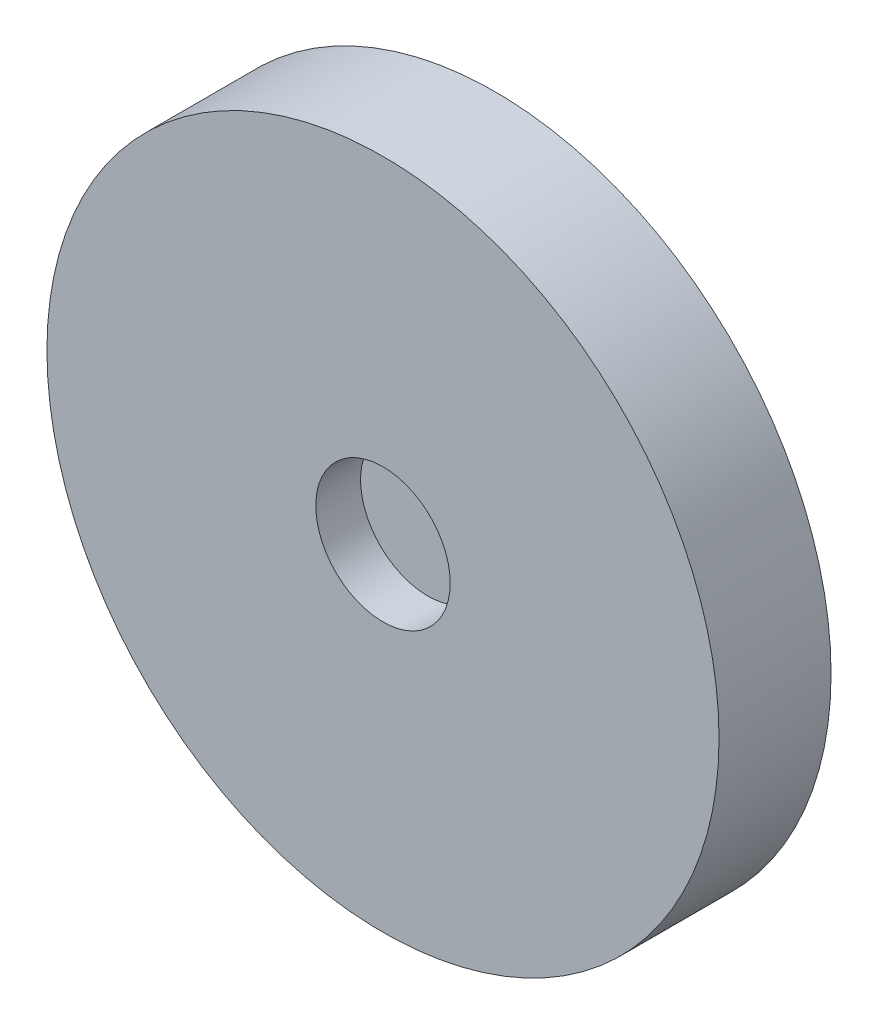
ISO-10303-21;
HEADER;
FILE_DESCRIPTION(('STEP AP214'),'2;1');
FILE_NAME('part.step','',(''),(''),'','','');
FILE_SCHEMA(('AUTOMOTIVE_DESIGN { 1 0 10303 214 1 1 1 1 }'));
ENDSEC;
DATA;
#1=APPLICATION_CONTEXT('core data for automotive mechanical design processes');
#2=APPLICATION_PROTOCOL_DEFINITION('international standard','automotive_design',2000,#1);
#3=PRODUCT_CONTEXT('',#1,'mechanical');
#4=PRODUCT('Part','Part','',(#3));
#5=PRODUCT_RELATED_PRODUCT_CATEGORY('part','',(#4));
#6=PRODUCT_DEFINITION_FORMATION('','',#4);
#7=PRODUCT_DEFINITION_CONTEXT('part definition',#1,'design');
#8=PRODUCT_DEFINITION('design','',#6,#7);
#9=PRODUCT_DEFINITION_SHAPE('','',#8);
#10=(LENGTH_UNIT() NAMED_UNIT(*) SI_UNIT(.MILLI.,.METRE.));
#11=(NAMED_UNIT(*) PLANE_ANGLE_UNIT() SI_UNIT($,.RADIAN.));
#12=(NAMED_UNIT(*) SI_UNIT($,.STERADIAN.) SOLID_ANGLE_UNIT());
#13=UNCERTAINTY_MEASURE_WITH_UNIT(LENGTH_MEASURE(1.E-05),#10,'distance_accuracy_value','');
#14=(GEOMETRIC_REPRESENTATION_CONTEXT(3) GLOBAL_UNCERTAINTY_ASSIGNED_CONTEXT((#13)) GLOBAL_UNIT_ASSIGNED_CONTEXT((#10,
#11,#12)) REPRESENTATION_CONTEXT('',''));
#15=CARTESIAN_POINT('',(0.,0.,0.));
#16=DIRECTION('',(0.,0.,1.));
#17=DIRECTION('',(1.,0.,0.));
#18=AXIS2_PLACEMENT_3D('',#15,#16,#17);
#19=CARTESIAN_POINT('',(0.,0.,50.));
#20=DIRECTION('',(0.,0.,-1.));
#21=DIRECTION('',(-1.,0.,0.));
#22=AXIS2_PLACEMENT_3D('',#19,#20,#21);
#23=CYLINDRICAL_SURFACE('',#22,150.);
#24=CARTESIAN_POINT('',(0.,0.,50.));
#25=DIRECTION('',(0.,0.,1.));
#26=DIRECTION('',(1.,0.,0.));
#27=AXIS2_PLACEMENT_3D('',#24,#25,#26);
#28=CIRCLE('',#27,150.);
#29=CARTESIAN_POINT('',(150.,0.,50.));
#30=VERTEX_POINT('',#29);
#31=EDGE_CURVE('E10',#30,#30,#28,.T.);
#32=ORIENTED_EDGE('',*,*,#31,.F.);
#33=EDGE_LOOP('',(#32));
#34=FACE_BOUND('',#33,.T.);
#35=CARTESIAN_POINT('',(0.,0.,0.));
#36=DIRECTION('',(0.,0.,1.));
#37=DIRECTION('',(1.,0.,0.));
#38=AXIS2_PLACEMENT_3D('',#35,#36,#37);
#39=CIRCLE('',#38,150.);
#40=CARTESIAN_POINT('',(150.,0.,0.));
#41=VERTEX_POINT('',#40);
#42=EDGE_CURVE('E40',#41,#41,#39,.T.);
#43=ORIENTED_EDGE('',*,*,#42,.T.);
#44=EDGE_LOOP('',(#43));
#45=FACE_BOUND('',#44,.T.);
#46=ADVANCED_FACE('F37',(#34,#45),#23,.T.);
#47=CARTESIAN_POINT('',(0.,0.,50.));
#48=DIRECTION('',(0.,0.,1.));
#49=DIRECTION('',(1.,0.,0.));
#50=AXIS2_PLACEMENT_3D('',#47,#48,#49);
#51=PLANE('',#50);
#52=CARTESIAN_POINT('',(0.,0.,50.));
#53=DIRECTION('',(0.,0.,1.));
#54=DIRECTION('',(1.,0.,0.));
#55=AXIS2_PLACEMENT_3D('',#52,#53,#54);
#56=CIRCLE('',#55,30.);
#57=CARTESIAN_POINT('',(30.,0.,50.));
#58=VERTEX_POINT('',#57);
#59=EDGE_CURVE('E51',#58,#58,#56,.T.);
#60=ORIENTED_EDGE('',*,*,#59,.F.);
#61=EDGE_LOOP('',(#60));
#62=FACE_BOUND('',#61,.T.);
#63=ORIENTED_EDGE('',*,*,#31,.T.);
#64=EDGE_LOOP('',(#63));
#65=FACE_BOUND('',#64,.T.);
#66=ADVANCED_FACE('F68',(#62,#65),#51,.T.);
#67=CARTESIAN_POINT('',(0.,0.,0.));
#68=DIRECTION('',(0.,0.,1.));
#69=DIRECTION('',(1.,0.,0.));
#70=AXIS2_PLACEMENT_3D('',#67,#68,#69);
#71=PLANE('',#70);
#72=ORIENTED_EDGE('',*,*,#42,.F.);
#73=EDGE_LOOP('',(#72));
#74=FACE_BOUND('',#73,.T.);
#75=ADVANCED_FACE('F64',(#74),#71,.F.);
#76=CARTESIAN_POINT('',(0.,0.,30.));
#77=DIRECTION('',(0.,0.,1.));
#78=DIRECTION('',(1.,0.,0.));
#79=AXIS2_PLACEMENT_3D('',#76,#77,#78);
#80=CYLINDRICAL_SURFACE('',#79,30.);
#81=CARTESIAN_POINT('',(0.,0.,30.));
#82=DIRECTION('',(0.,0.,1.));
#83=DIRECTION('',(1.,0.,0.));
#84=AXIS2_PLACEMENT_3D('',#81,#82,#83);
#85=CIRCLE('',#84,30.);
#86=CARTESIAN_POINT('',(30.,0.,30.));
#87=VERTEX_POINT('',#86);
#88=EDGE_CURVE('E49',#87,#87,#85,.T.);
#89=ORIENTED_EDGE('',*,*,#88,.F.);
#90=EDGE_LOOP('',(#89));
#91=FACE_BOUND('',#90,.T.);
#92=ORIENTED_EDGE('',*,*,#59,.T.);
#93=EDGE_LOOP('',(#92));
#94=FACE_BOUND('',#93,.T.);
#95=ADVANCED_FACE('F61',(#91,#94),#80,.F.);
#96=CARTESIAN_POINT('',(0.,0.,30.));
#97=DIRECTION('',(0.,0.,1.));
#98=DIRECTION('',(1.,0.,0.));
#99=AXIS2_PLACEMENT_3D('',#96,#97,#98);
#100=PLANE('',#99);
#101=ORIENTED_EDGE('',*,*,#88,.T.);
#102=EDGE_LOOP('',(#101));
#103=FACE_BOUND('',#102,.T.);
#104=ADVANCED_FACE('F59',(#103),#100,.T.);
#105=CLOSED_SHELL('',(#46,#66,#75,#95,#104));
#106=MANIFOLD_SOLID_BREP('B2',#105);
#107=ADVANCED_BREP_SHAPE_REPRESENTATION('',(#18,#106),#14);
#108=SHAPE_DEFINITION_REPRESENTATION(#9,#107);
ENDSEC;
END-ISO-10303-21;
